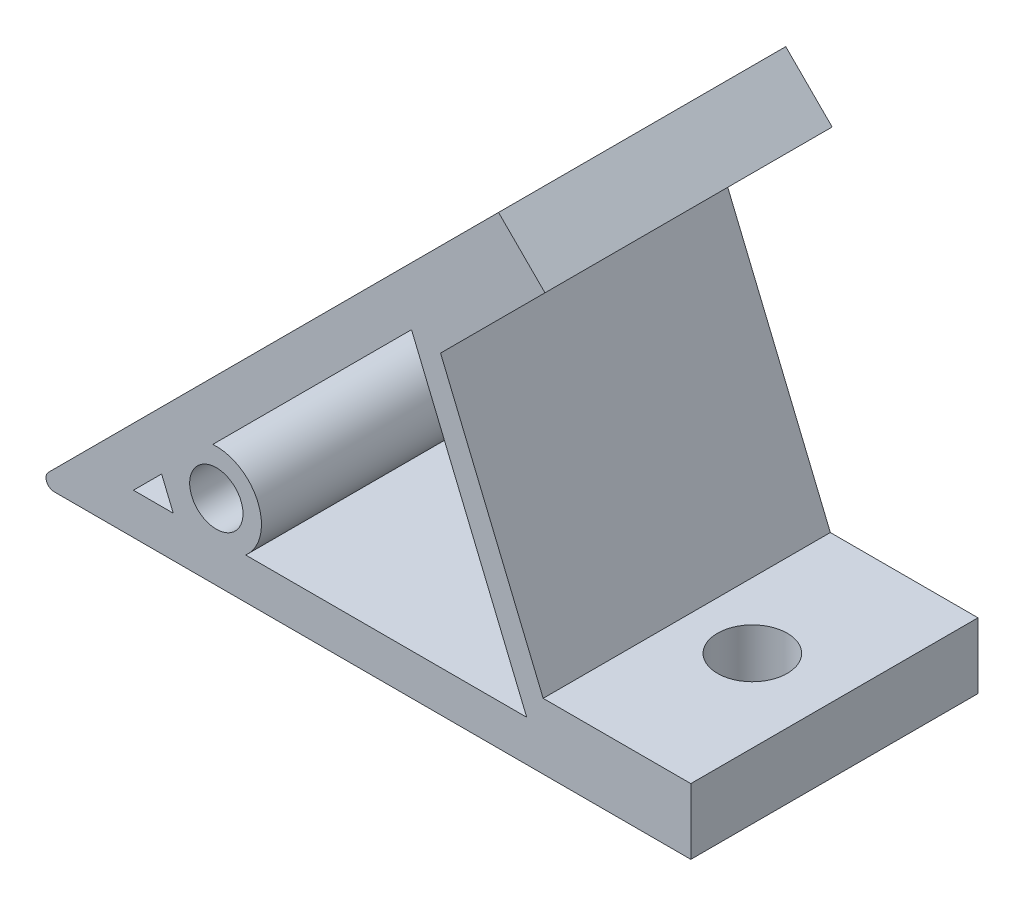
ISO-10303-21;
HEADER;
FILE_DESCRIPTION(('STEP AP214'),'2;1');
FILE_NAME('part.step','',(''),(''),'','','');
FILE_SCHEMA(('AUTOMOTIVE_DESIGN { 1 0 10303 214 1 1 1 1 }'));
ENDSEC;
DATA;
#1=APPLICATION_CONTEXT('core data for automotive mechanical design processes');
#2=APPLICATION_PROTOCOL_DEFINITION('international standard','automotive_design',2000,#1);
#3=PRODUCT_CONTEXT('',#1,'mechanical');
#4=PRODUCT('Part','Part','',(#3));
#5=PRODUCT_RELATED_PRODUCT_CATEGORY('part','',(#4));
#6=PRODUCT_DEFINITION_FORMATION('','',#4);
#7=PRODUCT_DEFINITION_CONTEXT('part definition',#1,'design');
#8=PRODUCT_DEFINITION('design','',#6,#7);
#9=PRODUCT_DEFINITION_SHAPE('','',#8);
#10=(LENGTH_UNIT() NAMED_UNIT(*) SI_UNIT(.MILLI.,.METRE.));
#11=(NAMED_UNIT(*) PLANE_ANGLE_UNIT() SI_UNIT($,.RADIAN.));
#12=(NAMED_UNIT(*) SI_UNIT($,.STERADIAN.) SOLID_ANGLE_UNIT());
#13=UNCERTAINTY_MEASURE_WITH_UNIT(LENGTH_MEASURE(1.E-05),#10,'distance_accuracy_value','');
#14=(GEOMETRIC_REPRESENTATION_CONTEXT(3) GLOBAL_UNCERTAINTY_ASSIGNED_CONTEXT((#13)) GLOBAL_UNIT_ASSIGNED_CONTEXT((#10,
#11,#12)) REPRESENTATION_CONTEXT('',''));
#15=CARTESIAN_POINT('',(0.,0.,0.));
#16=DIRECTION('',(0.,0.,1.));
#17=DIRECTION('',(1.,0.,0.));
#18=AXIS2_PLACEMENT_3D('',#15,#16,#17);
#19=CARTESIAN_POINT('',(-30.4993179415646,38.1869735594505,17.5));
#20=DIRECTION('',(-0.707106781186548,0.707106781186547,0.));
#21=DIRECTION('',(-0.707106781186547,-0.707106781186548,0.));
#22=AXIS2_PLACEMENT_3D('',#19,#20,#21);
#23=PLANE('',#22);
#24=DIRECTION('',(0.707106781186547,0.707106781186548,0.));
#25=VECTOR('',#24,1.);
#26=CARTESIAN_POINT('',(-30.4993179415646,38.1869735594505,-17.5));
#27=LINE('',#26,#25);
#28=CARTESIAN_POINT('',(-30.4993179415646,38.1869735594505,-17.5));
#29=VERTEX_POINT('',#28);
#30=CARTESIAN_POINT('',(-17.7746032555838,50.9116882454314,-17.5));
#31=VERTEX_POINT('',#30);
#32=EDGE_CURVE('E234',#29,#31,#27,.T.);
#33=ORIENTED_EDGE('',*,*,#32,.T.);
#34=DIRECTION('',(0.,0.,-1.));
#35=VECTOR('',#34,1.);
#36=CARTESIAN_POINT('',(-17.7746032555838,50.9116882454314,17.5));
#37=LINE('',#36,#35);
#38=CARTESIAN_POINT('',(-17.7746032555838,50.9116882454314,17.5));
#39=VERTEX_POINT('',#38);
#40=EDGE_CURVE('E244',#39,#31,#37,.T.);
#41=ORIENTED_EDGE('',*,*,#40,.F.);
#42=DIRECTION('',(0.707106781186547,0.707106781186548,0.));
#43=VECTOR('',#42,1.);
#44=CARTESIAN_POINT('',(-30.4993179415646,38.1869735594505,17.5));
#45=LINE('',#44,#43);
#46=CARTESIAN_POINT('',(-30.4993179415646,38.1869735594505,17.5));
#47=VERTEX_POINT('',#46);
#48=EDGE_CURVE('E217',#47,#39,#45,.T.);
#49=ORIENTED_EDGE('',*,*,#48,.F.);
#50=DIRECTION('',(0.,0.,-1.));
#51=VECTOR('',#50,1.);
#52=CARTESIAN_POINT('',(-30.4993179415646,38.1869735594505,17.5));
#53=LINE('',#52,#51);
#54=EDGE_CURVE('E247',#47,#29,#53,.T.);
#55=ORIENTED_EDGE('',*,*,#54,.T.);
#56=EDGE_LOOP('',(#33,#41,#49,#55));
#57=FACE_BOUND('',#56,.T.);
#58=CARTESIAN_POINT('',(-24.8456710674492,43.8406204335659,0.));
#59=DIRECTION('',(-0.70710678118655,0.707106781186545,0.));
#60=DIRECTION('',(-0.707106781186546,-0.707106781186549,0.));
#61=AXIS2_PLACEMENT_3D('',#58,#59,#60);
#62=CIRCLE('',#61,4.25);
#63=CARTESIAN_POINT('',(-27.850874887492,40.8354166135231,0.));
#64=VERTEX_POINT('',#63);
#65=EDGE_CURVE('E303',#64,#64,#62,.T.);
#66=ORIENTED_EDGE('',*,*,#65,.T.);
#67=EDGE_LOOP('',(#66));
#68=FACE_BOUND('',#67,.T.);
#69=ADVANCED_FACE('F33',(#57,#68),#23,.F.);
#70=CARTESIAN_POINT('',(-78.2928932188134,1.7071067811866,17.5));
#71=DIRECTION('',(0.707106781186548,-0.707106781186548,0.));
#72=DIRECTION('',(0.707106781186547,0.707106781186548,0.));
#73=AXIS2_PLACEMENT_3D('',#70,#71,#72);
#74=PLANE('',#73);
#75=DIRECTION('',(-0.707106781186547,-0.707106781186548,0.));
#76=VECTOR('',#75,1.);
#77=CARTESIAN_POINT('',(-78.2928932188134,1.7071067811866,-17.5));
#78=LINE('',#77,#76);
#79=CARTESIAN_POINT('',(-23.4314575050762,56.5685424949238,-17.5));
#80=VERTEX_POINT('',#79);
#81=CARTESIAN_POINT('',(-78.2928932188134,1.7071067811866,-17.5));
#82=VERTEX_POINT('',#81);
#83=EDGE_CURVE('E209',#80,#82,#78,.T.);
#84=ORIENTED_EDGE('',*,*,#83,.T.);
#85=DIRECTION('',(0.,0.,-1.));
#86=VECTOR('',#85,1.);
#87=CARTESIAN_POINT('',(-78.2928932188134,1.7071067811866,17.5));
#88=LINE('',#87,#86);
#89=CARTESIAN_POINT('',(-78.2928932188134,1.7071067811866,17.5));
#90=VERTEX_POINT('',#89);
#91=EDGE_CURVE('E223',#90,#82,#88,.T.);
#92=ORIENTED_EDGE('',*,*,#91,.F.);
#93=DIRECTION('',(-0.707106781186547,-0.707106781186548,0.));
#94=VECTOR('',#93,1.);
#95=CARTESIAN_POINT('',(-78.2928932188134,1.7071067811866,17.5));
#96=LINE('',#95,#94);
#97=CARTESIAN_POINT('',(-23.4314575050762,56.5685424949238,17.5));
#98=VERTEX_POINT('',#97);
#99=EDGE_CURVE('E221',#98,#90,#96,.T.);
#100=ORIENTED_EDGE('',*,*,#99,.F.);
#101=DIRECTION('',(0.,0.,-1.));
#102=VECTOR('',#101,1.);
#103=CARTESIAN_POINT('',(-23.4314575050762,56.5685424949238,17.5));
#104=LINE('',#103,#102);
#105=EDGE_CURVE('E241',#98,#80,#104,.T.);
#106=ORIENTED_EDGE('',*,*,#105,.T.);
#107=EDGE_LOOP('',(#84,#92,#100,#106));
#108=FACE_BOUND('',#107,.T.);
#109=CARTESIAN_POINT('',(-30.5025253169417,49.4974746830583,0.));
#110=DIRECTION('',(0.707106781186548,-0.707106781186548,0.));
#111=DIRECTION('',(0.707106781186547,0.707106781186548,0.));
#112=AXIS2_PLACEMENT_3D('',#109,#110,#111);
#113=CIRCLE('',#112,4.25);
#114=CARTESIAN_POINT('',(-27.4973214968988,52.5026785031012,0.));
#115=VERTEX_POINT('',#114);
#116=EDGE_CURVE('E37',#115,#115,#113,.F.);
#117=ORIENTED_EDGE('',*,*,#116,.F.);
#118=EDGE_LOOP('',(#117));
#119=FACE_BOUND('',#118,.T.);
#120=ADVANCED_FACE('F290',(#108,#119),#74,.F.);
#121=CARTESIAN_POINT('',(-77.5857864376269,1.,17.5));
#122=DIRECTION('',(0.,0.,1.));
#123=DIRECTION('',(1.,0.,0.));
#124=AXIS2_PLACEMENT_3D('',#121,#122,#123);
#125=PLANE('',#124);
#126=DIRECTION('',(1.,0.,0.));
#127=VECTOR('',#126,1.);
#128=CARTESIAN_POINT('',(-54.2574687525298,5.,17.5));
#129=LINE('',#128,#127);
#130=CARTESIAN_POINT('',(-54.2574687525298,5.,17.5));
#131=VERTEX_POINT('',#130);
#132=CARTESIAN_POINT('',(-20.,5.,17.5));
#133=VERTEX_POINT('',#132);
#134=EDGE_CURVE('E149',#131,#133,#129,.T.);
#135=ORIENTED_EDGE('',*,*,#134,.F.);
#136=CARTESIAN_POINT('',(-57.8268912197291,9.18440237676214,17.5));
#137=DIRECTION('',(0.,0.,-1.));
#138=DIRECTION('',(1.,0.,0.));
#139=AXIS2_PLACEMENT_3D('',#136,#137,#138);
#140=CIRCLE('',#139,5.49999999999996);
#141=CARTESIAN_POINT('',(-58.2617476840749,14.6671845040599,17.5));
#142=VERTEX_POINT('',#141);
#143=EDGE_CURVE('E141',#142,#131,#140,.T.);
#144=ORIENTED_EDGE('',*,*,#143,.F.);
#145=DIRECTION('',(-0.707106781186549,-0.707106781186546,0.));
#146=VECTOR('',#145,1.);
#147=CARTESIAN_POINT('',(-58.2617476840749,14.6671845040599,17.5));
#148=LINE('',#147,#146);
#149=CARTESIAN_POINT('',(-34.0380592228744,38.8908729652603,17.5));
#150=VERTEX_POINT('',#149);
#151=EDGE_CURVE('E165',#150,#142,#148,.T.);
#152=ORIENTED_EDGE('',*,*,#151,.F.);
#153=DIRECTION('',(-0.382683432365087,0.923879532511288,0.));
#154=VECTOR('',#153,1.);
#155=CARTESIAN_POINT('',(-20.,5.,17.5));
#156=LINE('',#155,#154);
#157=EDGE_CURVE('E163',#133,#150,#156,.T.);
#158=ORIENTED_EDGE('',*,*,#157,.F.);
#159=EDGE_LOOP('',(#135,#144,#152,#158));
#160=FACE_BOUND('',#159,.T.);
#161=CARTESIAN_POINT('',(-77.5857864376269,1.,17.5));
#162=DIRECTION('',(0.,0.,1.));
#163=DIRECTION('',(1.,0.,0.));
#164=AXIS2_PLACEMENT_3D('',#161,#162,#163);
#165=CIRCLE('',#164,1.);
#166=CARTESIAN_POINT('',(-77.5857864376269,0.,17.5));
#167=VERTEX_POINT('',#166);
#168=EDGE_CURVE('E205',#90,#167,#165,.T.);
#169=ORIENTED_EDGE('',*,*,#168,.T.);
#170=DIRECTION('',(1.,0.,0.));
#171=VECTOR('',#170,1.);
#172=CARTESIAN_POINT('',(-77.5857864376269,0.,17.5));
#173=LINE('',#172,#171);
#174=CARTESIAN_POINT('',(0.,0.,17.5));
#175=VERTEX_POINT('',#174);
#176=EDGE_CURVE('E208',#167,#175,#173,.T.);
#177=ORIENTED_EDGE('',*,*,#176,.T.);
#178=DIRECTION('',(0.,1.,0.));
#179=VECTOR('',#178,1.);
#180=CARTESIAN_POINT('',(0.,0.,17.5));
#181=LINE('',#180,#179);
#182=CARTESIAN_POINT('',(0.,8.,17.5));
#183=VERTEX_POINT('',#182);
#184=EDGE_CURVE('E211',#175,#183,#181,.T.);
#185=ORIENTED_EDGE('',*,*,#184,.T.);
#186=DIRECTION('',(-1.,0.,0.));
#187=VECTOR('',#186,1.);
#188=CARTESIAN_POINT('',(-17.995464086242,8.00000000000012,17.5));
#189=LINE('',#188,#187);
#190=CARTESIAN_POINT('',(-17.995464086242,8.00000000000012,17.5));
#191=VERTEX_POINT('',#190);
#192=EDGE_CURVE('E213',#183,#191,#189,.T.);
#193=ORIENTED_EDGE('',*,*,#192,.T.);
#194=DIRECTION('',(-0.382683432365096,0.923879532511284,0.));
#195=VECTOR('',#194,1.);
#196=CARTESIAN_POINT('',(-17.995464086242,8.00000000000012,17.5));
#197=LINE('',#196,#195);
#198=EDGE_CURVE('E215',#191,#47,#197,.T.);
#199=ORIENTED_EDGE('',*,*,#198,.T.);
#200=ORIENTED_EDGE('',*,*,#48,.T.);
#201=DIRECTION('',(-0.707106781186548,0.707106781186547,0.));
#202=VECTOR('',#201,1.);
#203=CARTESIAN_POINT('',(-17.7746032555838,50.9116882454314,17.5));
#204=LINE('',#203,#202);
#205=EDGE_CURVE('E219',#39,#98,#204,.T.);
#206=ORIENTED_EDGE('',*,*,#205,.T.);
#207=ORIENTED_EDGE('',*,*,#99,.T.);
#208=EDGE_LOOP('',(#169,#177,#185,#193,#199,#200,#206,#207));
#209=FACE_BOUND('',#208,.T.);
#210=DIRECTION('',(1.,0.,0.));
#211=VECTOR('',#210,1.);
#212=CARTESIAN_POINT('',(-67.9289321881347,5.,17.5));
#213=LINE('',#212,#211);
#214=CARTESIAN_POINT('',(-67.9289321881347,5.,17.5));
#215=VERTEX_POINT('',#214);
#216=CARTESIAN_POINT('',(-63.0744704704145,5.00000000000011,17.5));
#217=VERTEX_POINT('',#216);
#218=EDGE_CURVE('E183',#215,#217,#213,.T.);
#219=ORIENTED_EDGE('',*,*,#218,.F.);
#220=DIRECTION('',(-0.70710678118656,-0.707106781186535,0.));
#221=VECTOR('',#220,1.);
#222=CARTESIAN_POINT('',(-67.9289321881347,5.,17.5));
#223=LINE('',#222,#221);
#224=CARTESIAN_POINT('',(-64.4963093885244,8.43262279961016,17.5));
#225=VERTEX_POINT('',#224);
#226=EDGE_CURVE('E181',#225,#215,#223,.T.);
#227=ORIENTED_EDGE('',*,*,#226,.F.);
#228=DIRECTION('',(-0.382683432365157,0.923879532511259,0.));
#229=VECTOR('',#228,1.);
#230=CARTESIAN_POINT('',(-63.0744704704145,5.00000000000011,17.5));
#231=LINE('',#230,#229);
#232=EDGE_CURVE('E187',#217,#225,#231,.T.);
#233=ORIENTED_EDGE('',*,*,#232,.F.);
#234=EDGE_LOOP('',(#219,#227,#233));
#235=FACE_BOUND('',#234,.T.);
#236=CARTESIAN_POINT('',(-57.8268912197291,9.18440237676214,17.5));
#237=DIRECTION('',(0.,0.,1.));
#238=DIRECTION('',(1.,0.,0.));
#239=AXIS2_PLACEMENT_3D('',#236,#237,#238);
#240=CIRCLE('',#239,3.25);
#241=CARTESIAN_POINT('',(-54.5768912197291,9.18440237676214,17.5));
#242=VERTEX_POINT('',#241);
#243=EDGE_CURVE('E171',#242,#242,#240,.T.);
#244=ORIENTED_EDGE('',*,*,#243,.F.);
#245=EDGE_LOOP('',(#244));
#246=FACE_BOUND('',#245,.T.);
#247=ADVANCED_FACE('F161',(#160,#209,#235,#246),#125,.T.);
#248=CARTESIAN_POINT('',(-77.5857864376269,1.,-17.5));
#249=DIRECTION('',(0.,0.,1.));
#250=DIRECTION('',(1.,0.,0.));
#251=AXIS2_PLACEMENT_3D('',#248,#249,#250);
#252=PLANE('',#251);
#253=CARTESIAN_POINT('',(-57.8268912197291,9.18440237676214,-17.5));
#254=DIRECTION('',(0.,0.,-1.));
#255=DIRECTION('',(1.,0.,0.));
#256=AXIS2_PLACEMENT_3D('',#253,#254,#255);
#257=CIRCLE('',#256,5.49999999999996);
#258=CARTESIAN_POINT('',(-58.2617476840749,14.6671845040599,-17.5));
#259=VERTEX_POINT('',#258);
#260=CARTESIAN_POINT('',(-54.2574687525298,5.,-17.5));
#261=VERTEX_POINT('',#260);
#262=EDGE_CURVE('E57',#259,#261,#257,.T.);
#263=ORIENTED_EDGE('',*,*,#262,.T.);
#264=DIRECTION('',(1.,0.,0.));
#265=VECTOR('',#264,1.);
#266=CARTESIAN_POINT('',(-54.2574687525298,5.,-17.5));
#267=LINE('',#266,#265);
#268=CARTESIAN_POINT('',(-20.,5.,-17.5));
#269=VERTEX_POINT('',#268);
#270=EDGE_CURVE('E156',#261,#269,#267,.T.);
#271=ORIENTED_EDGE('',*,*,#270,.T.);
#272=DIRECTION('',(-0.382683432365087,0.923879532511288,0.));
#273=VECTOR('',#272,1.);
#274=CARTESIAN_POINT('',(-20.,5.,-17.5));
#275=LINE('',#274,#273);
#276=CARTESIAN_POINT('',(-34.0380592228744,38.8908729652603,-17.5));
#277=VERTEX_POINT('',#276);
#278=EDGE_CURVE('E173',#269,#277,#275,.T.);
#279=ORIENTED_EDGE('',*,*,#278,.T.);
#280=DIRECTION('',(-0.707106781186549,-0.707106781186546,0.));
#281=VECTOR('',#280,1.);
#282=CARTESIAN_POINT('',(-58.2617476840749,14.6671845040599,-17.5));
#283=LINE('',#282,#281);
#284=EDGE_CURVE('E150',#277,#259,#283,.T.);
#285=ORIENTED_EDGE('',*,*,#284,.T.);
#286=EDGE_LOOP('',(#263,#271,#279,#285));
#287=FACE_BOUND('',#286,.T.);
#288=CARTESIAN_POINT('',(-77.5857864376269,1.,-17.5));
#289=DIRECTION('',(0.,0.,1.));
#290=DIRECTION('',(1.,0.,0.));
#291=AXIS2_PLACEMENT_3D('',#288,#289,#290);
#292=CIRCLE('',#291,1.);
#293=CARTESIAN_POINT('',(-77.5857864376269,0.,-17.5));
#294=VERTEX_POINT('',#293);
#295=EDGE_CURVE('E204',#82,#294,#292,.T.);
#296=ORIENTED_EDGE('',*,*,#295,.F.);
#297=ORIENTED_EDGE('',*,*,#83,.F.);
#298=DIRECTION('',(-0.707106781186548,0.707106781186547,0.));
#299=VECTOR('',#298,1.);
#300=CARTESIAN_POINT('',(-17.7746032555838,50.9116882454314,-17.5));
#301=LINE('',#300,#299);
#302=EDGE_CURVE('E236',#31,#80,#301,.T.);
#303=ORIENTED_EDGE('',*,*,#302,.F.);
#304=ORIENTED_EDGE('',*,*,#32,.F.);
#305=DIRECTION('',(-0.382683432365096,0.923879532511284,0.));
#306=VECTOR('',#305,1.);
#307=CARTESIAN_POINT('',(-17.995464086242,8.00000000000012,-17.5));
#308=LINE('',#307,#306);
#309=CARTESIAN_POINT('',(-17.995464086242,8.00000000000012,-17.5));
#310=VERTEX_POINT('',#309);
#311=EDGE_CURVE('E232',#310,#29,#308,.T.);
#312=ORIENTED_EDGE('',*,*,#311,.F.);
#313=DIRECTION('',(-1.,0.,0.));
#314=VECTOR('',#313,1.);
#315=CARTESIAN_POINT('',(-17.995464086242,8.00000000000012,-17.5));
#316=LINE('',#315,#314);
#317=CARTESIAN_POINT('',(0.,8.,-17.5));
#318=VERTEX_POINT('',#317);
#319=EDGE_CURVE('E230',#318,#310,#316,.T.);
#320=ORIENTED_EDGE('',*,*,#319,.F.);
#321=DIRECTION('',(0.,1.,0.));
#322=VECTOR('',#321,1.);
#323=CARTESIAN_POINT('',(0.,0.,-17.5));
#324=LINE('',#323,#322);
#325=CARTESIAN_POINT('',(0.,0.,-17.5));
#326=VERTEX_POINT('',#325);
#327=EDGE_CURVE('E228',#326,#318,#324,.T.);
#328=ORIENTED_EDGE('',*,*,#327,.F.);
#329=DIRECTION('',(1.,0.,0.));
#330=VECTOR('',#329,1.);
#331=CARTESIAN_POINT('',(-77.5857864376269,0.,-17.5));
#332=LINE('',#331,#330);
#333=EDGE_CURVE('E226',#294,#326,#332,.T.);
#334=ORIENTED_EDGE('',*,*,#333,.F.);
#335=EDGE_LOOP('',(#296,#297,#303,#304,#312,#320,#328,#334));
#336=FACE_BOUND('',#335,.T.);
#337=DIRECTION('',(-0.70710678118656,-0.707106781186535,0.));
#338=VECTOR('',#337,1.);
#339=CARTESIAN_POINT('',(-67.9289321881347,5.,-17.5));
#340=LINE('',#339,#338);
#341=CARTESIAN_POINT('',(-64.4963093885244,8.43262279961016,-17.5));
#342=VERTEX_POINT('',#341);
#343=CARTESIAN_POINT('',(-67.9289321881347,5.,-17.5));
#344=VERTEX_POINT('',#343);
#345=EDGE_CURVE('E157',#342,#344,#340,.T.);
#346=ORIENTED_EDGE('',*,*,#345,.T.);
#347=DIRECTION('',(1.,0.,0.));
#348=VECTOR('',#347,1.);
#349=CARTESIAN_POINT('',(-67.9289321881347,5.,-17.5));
#350=LINE('',#349,#348);
#351=CARTESIAN_POINT('',(-63.0744704704145,5.00000000000011,-17.5));
#352=VERTEX_POINT('',#351);
#353=EDGE_CURVE('E192',#344,#352,#350,.T.);
#354=ORIENTED_EDGE('',*,*,#353,.T.);
#355=DIRECTION('',(-0.382683432365157,0.923879532511259,0.));
#356=VECTOR('',#355,1.);
#357=CARTESIAN_POINT('',(-63.0744704704145,5.00000000000011,-17.5));
#358=LINE('',#357,#356);
#359=EDGE_CURVE('E184',#352,#342,#358,.T.);
#360=ORIENTED_EDGE('',*,*,#359,.T.);
#361=EDGE_LOOP('',(#346,#354,#360));
#362=FACE_BOUND('',#361,.T.);
#363=CARTESIAN_POINT('',(-57.8268912197291,9.18440237676214,-17.5));
#364=DIRECTION('',(0.,0.,1.));
#365=DIRECTION('',(1.,0.,0.));
#366=AXIS2_PLACEMENT_3D('',#363,#364,#365);
#367=CIRCLE('',#366,3.25);
#368=CARTESIAN_POINT('',(-54.5768912197291,9.18440237676214,-17.5));
#369=VERTEX_POINT('',#368);
#370=EDGE_CURVE('E314',#369,#369,#367,.T.);
#371=ORIENTED_EDGE('',*,*,#370,.T.);
#372=EDGE_LOOP('',(#371));
#373=FACE_BOUND('',#372,.T.);
#374=ADVANCED_FACE('F267',(#287,#336,#362,#373),#252,.F.);
#375=CARTESIAN_POINT('',(-77.5857864376269,1.,17.5));
#376=DIRECTION('',(0.,0.,-1.));
#377=DIRECTION('',(-1.,0.,0.));
#378=AXIS2_PLACEMENT_3D('',#375,#376,#377);
#379=CYLINDRICAL_SURFACE('',#378,1.);
#380=ORIENTED_EDGE('',*,*,#295,.T.);
#381=DIRECTION('',(0.,0.,-1.));
#382=VECTOR('',#381,1.);
#383=CARTESIAN_POINT('',(-77.5857864376269,0.,17.5));
#384=LINE('',#383,#382);
#385=EDGE_CURVE('E11',#167,#294,#384,.T.);
#386=ORIENTED_EDGE('',*,*,#385,.F.);
#387=ORIENTED_EDGE('',*,*,#168,.F.);
#388=ORIENTED_EDGE('',*,*,#91,.T.);
#389=EDGE_LOOP('',(#380,#386,#387,#388));
#390=FACE_BOUND('',#389,.T.);
#391=ADVANCED_FACE('F35',(#390),#379,.T.);
#392=CARTESIAN_POINT('',(-77.5857864376269,0.,17.5));
#393=DIRECTION('',(0.,1.,0.));
#394=DIRECTION('',(0.,0.,1.));
#395=AXIS2_PLACEMENT_3D('',#392,#393,#394);
#396=PLANE('',#395);
#397=CARTESIAN_POINT('',(-10.,0.,0.));
#398=DIRECTION('',(0.,1.,0.));
#399=DIRECTION('',(0.,0.,1.));
#400=AXIS2_PLACEMENT_3D('',#397,#398,#399);
#401=CIRCLE('',#400,4.25);
#402=CARTESIAN_POINT('',(-10.,0.,4.25));
#403=VERTEX_POINT('',#402);
#404=EDGE_CURVE('E311',#403,#403,#401,.T.);
#405=ORIENTED_EDGE('',*,*,#404,.T.);
#406=EDGE_LOOP('',(#405));
#407=FACE_BOUND('',#406,.T.);
#408=ORIENTED_EDGE('',*,*,#333,.T.);
#409=DIRECTION('',(0.,0.,-1.));
#410=VECTOR('',#409,1.);
#411=CARTESIAN_POINT('',(0.,0.,17.5));
#412=LINE('',#411,#410);
#413=EDGE_CURVE('E42',#175,#326,#412,.T.);
#414=ORIENTED_EDGE('',*,*,#413,.F.);
#415=ORIENTED_EDGE('',*,*,#176,.F.);
#416=ORIENTED_EDGE('',*,*,#385,.T.);
#417=EDGE_LOOP('',(#408,#414,#415,#416));
#418=FACE_BOUND('',#417,.T.);
#419=ADVANCED_FACE('F284',(#407,#418),#396,.F.);
#420=CARTESIAN_POINT('',(0.,0.,17.5));
#421=DIRECTION('',(-1.,0.,0.));
#422=DIRECTION('',(0.,0.,1.));
#423=AXIS2_PLACEMENT_3D('',#420,#421,#422);
#424=PLANE('',#423);
#425=ORIENTED_EDGE('',*,*,#327,.T.);
#426=DIRECTION('',(0.,0.,-1.));
#427=VECTOR('',#426,1.);
#428=CARTESIAN_POINT('',(0.,8.,17.5));
#429=LINE('',#428,#427);
#430=EDGE_CURVE('E253',#183,#318,#429,.T.);
#431=ORIENTED_EDGE('',*,*,#430,.F.);
#432=ORIENTED_EDGE('',*,*,#184,.F.);
#433=ORIENTED_EDGE('',*,*,#413,.T.);
#434=EDGE_LOOP('',(#425,#431,#432,#433));
#435=FACE_BOUND('',#434,.T.);
#436=ADVANCED_FACE('F261',(#435),#424,.F.);
#437=CARTESIAN_POINT('',(-17.995464086242,8.00000000000012,17.5));
#438=DIRECTION('',(0.,-1.,0.));
#439=DIRECTION('',(1.,0.,0.));
#440=AXIS2_PLACEMENT_3D('',#437,#438,#439);
#441=PLANE('',#440);
#442=CARTESIAN_POINT('',(-10.,8.00000000000006,0.));
#443=DIRECTION('',(0.,1.,0.));
#444=DIRECTION('',(-1.,0.,0.));
#445=AXIS2_PLACEMENT_3D('',#442,#443,#444);
#446=CIRCLE('',#445,4.25);
#447=CARTESIAN_POINT('',(-14.25,8.00000000000009,0.));
#448=VERTEX_POINT('',#447);
#449=EDGE_CURVE('E307',#448,#448,#446,.T.);
#450=ORIENTED_EDGE('',*,*,#449,.F.);
#451=EDGE_LOOP('',(#450));
#452=FACE_BOUND('',#451,.T.);
#453=ORIENTED_EDGE('',*,*,#319,.T.);
#454=DIRECTION('',(0.,0.,-1.));
#455=VECTOR('',#454,1.);
#456=CARTESIAN_POINT('',(-17.995464086242,8.00000000000012,17.5));
#457=LINE('',#456,#455);
#458=EDGE_CURVE('E250',#191,#310,#457,.T.);
#459=ORIENTED_EDGE('',*,*,#458,.F.);
#460=ORIENTED_EDGE('',*,*,#192,.F.);
#461=ORIENTED_EDGE('',*,*,#430,.T.);
#462=EDGE_LOOP('',(#453,#459,#460,#461));
#463=FACE_BOUND('',#462,.T.);
#464=ADVANCED_FACE('F273',(#452,#463),#441,.F.);
#465=CARTESIAN_POINT('',(-17.995464086242,8.00000000000012,17.5));
#466=DIRECTION('',(-0.923879532511284,-0.382683432365096,0.));
#467=DIRECTION('',(0.382683432365096,-0.923879532511284,0.));
#468=AXIS2_PLACEMENT_3D('',#465,#466,#467);
#469=PLANE('',#468);
#470=ORIENTED_EDGE('',*,*,#311,.T.);
#471=ORIENTED_EDGE('',*,*,#54,.F.);
#472=ORIENTED_EDGE('',*,*,#198,.F.);
#473=ORIENTED_EDGE('',*,*,#458,.T.);
#474=EDGE_LOOP('',(#470,#471,#472,#473));
#475=FACE_BOUND('',#474,.T.);
#476=ADVANCED_FACE('F277',(#475),#469,.F.);
#477=CARTESIAN_POINT('',(-17.7746032555838,50.9116882454314,17.5));
#478=DIRECTION('',(-0.707106781186547,-0.707106781186548,0.));
#479=DIRECTION('',(0.707106781186548,-0.707106781186547,0.));
#480=AXIS2_PLACEMENT_3D('',#477,#478,#479);
#481=PLANE('',#480);
#482=ORIENTED_EDGE('',*,*,#302,.T.);
#483=ORIENTED_EDGE('',*,*,#105,.F.);
#484=ORIENTED_EDGE('',*,*,#205,.F.);
#485=ORIENTED_EDGE('',*,*,#40,.T.);
#486=EDGE_LOOP('',(#482,#483,#484,#485));
#487=FACE_BOUND('',#486,.T.);
#488=ADVANCED_FACE('F296',(#487),#481,.F.);
#489=CARTESIAN_POINT('',(-67.9289321881347,5.,17.5));
#490=DIRECTION('',(0.707106781186535,-0.70710678118656,0.));
#491=DIRECTION('',(0.70710678118656,0.707106781186535,0.));
#492=AXIS2_PLACEMENT_3D('',#489,#490,#491);
#493=PLANE('',#492);
#494=ORIENTED_EDGE('',*,*,#345,.F.);
#495=DIRECTION('',(0.,0.,-1.));
#496=VECTOR('',#495,1.);
#497=CARTESIAN_POINT('',(-64.4963093885244,8.43262279961016,17.5));
#498=LINE('',#497,#496);
#499=EDGE_CURVE('E189',#225,#342,#498,.T.);
#500=ORIENTED_EDGE('',*,*,#499,.F.);
#501=ORIENTED_EDGE('',*,*,#226,.T.);
#502=DIRECTION('',(0.,0.,-1.));
#503=VECTOR('',#502,1.);
#504=CARTESIAN_POINT('',(-67.9289321881347,5.,17.5));
#505=LINE('',#504,#503);
#506=EDGE_CURVE('E201',#215,#344,#505,.T.);
#507=ORIENTED_EDGE('',*,*,#506,.T.);
#508=EDGE_LOOP('',(#494,#500,#501,#507));
#509=FACE_BOUND('',#508,.T.);
#510=ADVANCED_FACE('F351',(#509),#493,.T.);
#511=CARTESIAN_POINT('',(-67.9289321881347,5.,17.5));
#512=DIRECTION('',(0.,1.,0.));
#513=DIRECTION('',(-1.,0.,0.));
#514=AXIS2_PLACEMENT_3D('',#511,#512,#513);
#515=PLANE('',#514);
#516=ORIENTED_EDGE('',*,*,#353,.F.);
#517=ORIENTED_EDGE('',*,*,#506,.F.);
#518=ORIENTED_EDGE('',*,*,#218,.T.);
#519=DIRECTION('',(0.,0.,-1.));
#520=VECTOR('',#519,1.);
#521=CARTESIAN_POINT('',(-63.0744704704145,5.00000000000011,17.5));
#522=LINE('',#521,#520);
#523=EDGE_CURVE('E199',#217,#352,#522,.T.);
#524=ORIENTED_EDGE('',*,*,#523,.T.);
#525=EDGE_LOOP('',(#516,#517,#518,#524));
#526=FACE_BOUND('',#525,.T.);
#527=ADVANCED_FACE('F347',(#526),#515,.T.);
#528=CARTESIAN_POINT('',(-63.0744704704145,5.00000000000011,17.5));
#529=DIRECTION('',(-0.923879532511259,-0.382683432365157,0.));
#530=DIRECTION('',(0.382683432365157,-0.923879532511259,0.));
#531=AXIS2_PLACEMENT_3D('',#528,#529,#530);
#532=PLANE('',#531);
#533=ORIENTED_EDGE('',*,*,#359,.F.);
#534=ORIENTED_EDGE('',*,*,#523,.F.);
#535=ORIENTED_EDGE('',*,*,#232,.T.);
#536=ORIENTED_EDGE('',*,*,#499,.T.);
#537=EDGE_LOOP('',(#533,#534,#535,#536));
#538=FACE_BOUND('',#537,.T.);
#539=ADVANCED_FACE('F344',(#538),#532,.T.);
#540=CARTESIAN_POINT('',(-57.8268912197291,9.18440237676214,17.5));
#541=DIRECTION('',(0.,0.,-1.));
#542=DIRECTION('',(-1.,0.,0.));
#543=AXIS2_PLACEMENT_3D('',#540,#541,#542);
#544=CYLINDRICAL_SURFACE('',#543,5.49999999999996);
#545=ORIENTED_EDGE('',*,*,#262,.F.);
#546=DIRECTION('',(0.,0.,-1.));
#547=VECTOR('',#546,1.);
#548=CARTESIAN_POINT('',(-58.2617476840749,14.6671845040599,17.5));
#549=LINE('',#548,#547);
#550=EDGE_CURVE('E145',#142,#259,#549,.T.);
#551=ORIENTED_EDGE('',*,*,#550,.F.);
#552=ORIENTED_EDGE('',*,*,#143,.T.);
#553=DIRECTION('',(0.,0.,-1.));
#554=VECTOR('',#553,1.);
#555=CARTESIAN_POINT('',(-54.2574687525298,5.,17.5));
#556=LINE('',#555,#554);
#557=EDGE_CURVE('E144',#131,#261,#556,.T.);
#558=ORIENTED_EDGE('',*,*,#557,.T.);
#559=EDGE_LOOP('',(#545,#551,#552,#558));
#560=FACE_BOUND('',#559,.T.);
#561=ADVANCED_FACE('F143',(#560),#544,.T.);
#562=CARTESIAN_POINT('',(-54.2574687525298,5.,17.5));
#563=DIRECTION('',(0.,1.,0.));
#564=DIRECTION('',(0.,0.,1.));
#565=AXIS2_PLACEMENT_3D('',#562,#563,#564);
#566=PLANE('',#565);
#567=ORIENTED_EDGE('',*,*,#270,.F.);
#568=ORIENTED_EDGE('',*,*,#557,.F.);
#569=ORIENTED_EDGE('',*,*,#134,.T.);
#570=DIRECTION('',(0.,0.,-1.));
#571=VECTOR('',#570,1.);
#572=CARTESIAN_POINT('',(-20.,5.,17.5));
#573=LINE('',#572,#571);
#574=EDGE_CURVE('E158',#133,#269,#573,.T.);
#575=ORIENTED_EDGE('',*,*,#574,.T.);
#576=EDGE_LOOP('',(#567,#568,#569,#575));
#577=FACE_BOUND('',#576,.T.);
#578=ADVANCED_FACE('F153',(#577),#566,.T.);
#579=CARTESIAN_POINT('',(-20.,5.,17.5));
#580=DIRECTION('',(-0.923879532511288,-0.382683432365087,0.));
#581=DIRECTION('',(0.382683432365087,-0.923879532511288,0.));
#582=AXIS2_PLACEMENT_3D('',#579,#580,#581);
#583=PLANE('',#582);
#584=ORIENTED_EDGE('',*,*,#278,.F.);
#585=ORIENTED_EDGE('',*,*,#574,.F.);
#586=ORIENTED_EDGE('',*,*,#157,.T.);
#587=DIRECTION('',(0.,0.,-1.));
#588=VECTOR('',#587,1.);
#589=CARTESIAN_POINT('',(-34.0380592228744,38.8908729652603,17.5));
#590=LINE('',#589,#588);
#591=EDGE_CURVE('E49',#150,#277,#590,.T.);
#592=ORIENTED_EDGE('',*,*,#591,.T.);
#593=EDGE_LOOP('',(#584,#585,#586,#592));
#594=FACE_BOUND('',#593,.T.);
#595=ADVANCED_FACE('F333',(#594),#583,.T.);
#596=CARTESIAN_POINT('',(-58.2617476840749,14.6671845040599,17.5));
#597=DIRECTION('',(0.707106781186546,-0.707106781186549,0.));
#598=DIRECTION('',(0.707106781186549,0.707106781186546,0.));
#599=AXIS2_PLACEMENT_3D('',#596,#597,#598);
#600=PLANE('',#599);
#601=ORIENTED_EDGE('',*,*,#284,.F.);
#602=ORIENTED_EDGE('',*,*,#591,.F.);
#603=ORIENTED_EDGE('',*,*,#151,.T.);
#604=ORIENTED_EDGE('',*,*,#550,.T.);
#605=EDGE_LOOP('',(#601,#602,#603,#604));
#606=FACE_BOUND('',#605,.T.);
#607=ADVANCED_FACE('F323',(#606),#600,.T.);
#608=CARTESIAN_POINT('',(-57.8268912197291,9.18440237676214,17.5));
#609=DIRECTION('',(0.,0.,-1.));
#610=DIRECTION('',(-1.,0.,0.));
#611=AXIS2_PLACEMENT_3D('',#608,#609,#610);
#612=CYLINDRICAL_SURFACE('',#611,3.25);
#613=ORIENTED_EDGE('',*,*,#243,.T.);
#614=EDGE_LOOP('',(#613));
#615=FACE_BOUND('',#614,.T.);
#616=ORIENTED_EDGE('',*,*,#370,.F.);
#617=EDGE_LOOP('',(#616));
#618=FACE_BOUND('',#617,.T.);
#619=ADVANCED_FACE('F320',(#615,#618),#612,.F.);
#620=CARTESIAN_POINT('',(-10.0000000000001,-8.99999999999994,0.));
#621=DIRECTION('',(0.,1.,0.));
#622=DIRECTION('',(-1.,0.,0.));
#623=AXIS2_PLACEMENT_3D('',#620,#621,#622);
#624=CYLINDRICAL_SURFACE('',#623,4.25);
#625=ORIENTED_EDGE('',*,*,#449,.T.);
#626=EDGE_LOOP('',(#625));
#627=FACE_BOUND('',#626,.T.);
#628=ORIENTED_EDGE('',*,*,#404,.F.);
#629=EDGE_LOOP('',(#628));
#630=FACE_BOUND('',#629,.T.);
#631=ADVANCED_FACE('F322',(#627,#630),#624,.F.);
#632=CARTESIAN_POINT('',(-36.8664863476205,55.8614357137372,0.));
#633=DIRECTION('',(0.70710678118655,-0.707106781186545,0.));
#634=DIRECTION('',(0.707106781186545,0.70710678118655,0.));
#635=AXIS2_PLACEMENT_3D('',#632,#633,#634);
#636=CYLINDRICAL_SURFACE('',#635,4.25);
#637=ORIENTED_EDGE('',*,*,#65,.F.);
#638=EDGE_LOOP('',(#637));
#639=FACE_BOUND('',#638,.T.);
#640=ORIENTED_EDGE('',*,*,#116,.T.);
#641=EDGE_LOOP('',(#640));
#642=FACE_BOUND('',#641,.T.);
#643=ADVANCED_FACE('F330',(#639,#642),#636,.F.);
#644=CLOSED_SHELL('',(#69,#120,#247,#374,#391,#419,#436,#464,#476,#488,#510,#527,#539,#561,#578,
#595,#607,#619,#631,#643));
#645=MANIFOLD_SOLID_BREP('B2',#644);
#646=ADVANCED_BREP_SHAPE_REPRESENTATION('',(#18,#645),#14);
#647=SHAPE_DEFINITION_REPRESENTATION(#9,#646);
ENDSEC;
END-ISO-10303-21;
